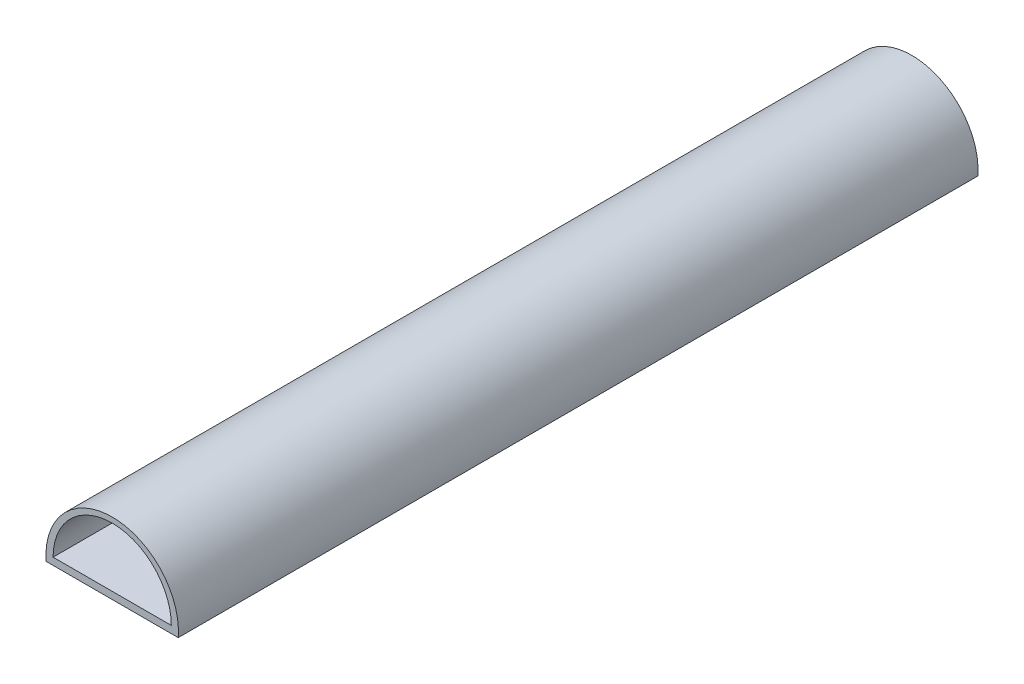
ISO-10303-21;
HEADER;
FILE_DESCRIPTION(('STEP AP214'),'2;1');
FILE_NAME('part.step','',(''),(''),'','','');
FILE_SCHEMA(('AUTOMOTIVE_DESIGN { 1 0 10303 214 1 1 1 1 }'));
ENDSEC;
DATA;
#1=APPLICATION_CONTEXT('core data for automotive mechanical design processes');
#2=APPLICATION_PROTOCOL_DEFINITION('international standard','automotive_design',2000,#1);
#3=PRODUCT_CONTEXT('',#1,'mechanical');
#4=PRODUCT('Part','Part','',(#3));
#5=PRODUCT_RELATED_PRODUCT_CATEGORY('part','',(#4));
#6=PRODUCT_DEFINITION_FORMATION('','',#4);
#7=PRODUCT_DEFINITION_CONTEXT('part definition',#1,'design');
#8=PRODUCT_DEFINITION('design','',#6,#7);
#9=PRODUCT_DEFINITION_SHAPE('','',#8);
#10=(LENGTH_UNIT() NAMED_UNIT(*) SI_UNIT(.MILLI.,.METRE.));
#11=(NAMED_UNIT(*) PLANE_ANGLE_UNIT() SI_UNIT($,.RADIAN.));
#12=(NAMED_UNIT(*) SI_UNIT($,.STERADIAN.) SOLID_ANGLE_UNIT());
#13=UNCERTAINTY_MEASURE_WITH_UNIT(LENGTH_MEASURE(1.E-05),#10,'distance_accuracy_value','');
#14=(GEOMETRIC_REPRESENTATION_CONTEXT(3) GLOBAL_UNCERTAINTY_ASSIGNED_CONTEXT((#13)) GLOBAL_UNIT_ASSIGNED_CONTEXT((#10,
#11,#12)) REPRESENTATION_CONTEXT('',''));
#15=CARTESIAN_POINT('',(0.,0.,0.));
#16=DIRECTION('',(0.,0.,1.));
#17=DIRECTION('',(1.,0.,0.));
#18=AXIS2_PLACEMENT_3D('',#15,#16,#17);
#19=CARTESIAN_POINT('',(-8.42700279293845,-8.87685553456328,177.8));
#20=DIRECTION('',(0.,0.,-1.));
#21=DIRECTION('',(-1.,0.,0.));
#22=AXIS2_PLACEMENT_3D('',#19,#20,#21);
#23=PLANE('',#22);
#24=CARTESIAN_POINT('',(-8.42700279293845,-8.87685553456328,177.8));
#25=DIRECTION('',(0.,0.,1.));
#26=DIRECTION('',(-1.,0.,0.));
#27=AXIS2_PLACEMENT_3D('',#24,#25,#26);
#28=CIRCLE('',#27,14.7310367744908);
#29=CARTESIAN_POINT('',(6.25737220706155,-10.0484251273645,177.8));
#30=VERTEX_POINT('',#29);
#31=CARTESIAN_POINT('',(-23.1113777929385,-10.0484251273645,177.8));
#32=VERTEX_POINT('',#31);
#33=EDGE_CURVE('E103',#30,#32,#28,.T.);
#34=ORIENTED_EDGE('',*,*,#33,.T.);
#35=DIRECTION('',(1.,0.,0.));
#36=VECTOR('',#35,1.);
#37=CARTESIAN_POINT('',(-23.1113777929385,-10.0484251273645,177.8));
#38=LINE('',#37,#36);
#39=EDGE_CURVE('E107',#32,#30,#38,.T.);
#40=ORIENTED_EDGE('',*,*,#39,.T.);
#41=EDGE_LOOP('',(#34,#40));
#42=FACE_BOUND('',#41,.T.);
#43=CARTESIAN_POINT('',(-8.42700279293845,-8.46092512736455,177.8));
#44=DIRECTION('',(0.,0.,1.));
#45=DIRECTION('',(-1.,0.,0.));
#46=AXIS2_PLACEMENT_3D('',#43,#44,#45);
#47=CIRCLE('',#46,13.1445);
#48=CARTESIAN_POINT('',(4.71749720706154,-8.46092512736455,177.8));
#49=VERTEX_POINT('',#48);
#50=CARTESIAN_POINT('',(-21.5715027929384,-8.46092512736455,177.8));
#51=VERTEX_POINT('',#50);
#52=EDGE_CURVE('E83',#49,#51,#47,.T.);
#53=ORIENTED_EDGE('',*,*,#52,.F.);
#54=DIRECTION('',(1.,0.,0.));
#55=VECTOR('',#54,1.);
#56=CARTESIAN_POINT('',(-8.42700279293845,-8.46092512736455,177.8));
#57=LINE('',#56,#55);
#58=EDGE_CURVE('E78',#51,#49,#57,.T.);
#59=ORIENTED_EDGE('',*,*,#58,.F.);
#60=EDGE_LOOP('',(#53,#59));
#61=FACE_BOUND('',#60,.T.);
#62=ADVANCED_FACE('F39',(#42,#61),#23,.F.);
#63=CARTESIAN_POINT('',(-8.42700279293845,-8.87685553456328,0.));
#64=DIRECTION('',(0.,0.,-1.));
#65=DIRECTION('',(-1.,0.,0.));
#66=AXIS2_PLACEMENT_3D('',#63,#64,#65);
#67=PLANE('',#66);
#68=CARTESIAN_POINT('',(-8.42700279293845,-8.87685553456328,0.));
#69=DIRECTION('',(0.,0.,1.));
#70=DIRECTION('',(-1.,0.,0.));
#71=AXIS2_PLACEMENT_3D('',#68,#69,#70);
#72=CIRCLE('',#71,14.7310367744908);
#73=CARTESIAN_POINT('',(6.25737220706155,-10.0484251273645,0.));
#74=VERTEX_POINT('',#73);
#75=CARTESIAN_POINT('',(-23.1113777929385,-10.0484251273645,0.));
#76=VERTEX_POINT('',#75);
#77=EDGE_CURVE('E92',#74,#76,#72,.T.);
#78=ORIENTED_EDGE('',*,*,#77,.F.);
#79=DIRECTION('',(1.,0.,0.));
#80=VECTOR('',#79,1.);
#81=CARTESIAN_POINT('',(-23.1113777929385,-10.0484251273645,0.));
#82=LINE('',#81,#80);
#83=EDGE_CURVE('E108',#76,#74,#82,.T.);
#84=ORIENTED_EDGE('',*,*,#83,.F.);
#85=EDGE_LOOP('',(#78,#84));
#86=FACE_BOUND('',#85,.T.);
#87=DIRECTION('',(1.,0.,0.));
#88=VECTOR('',#87,1.);
#89=CARTESIAN_POINT('',(-8.42700279293845,-8.46092512736455,0.));
#90=LINE('',#89,#88);
#91=CARTESIAN_POINT('',(-21.5715027929384,-8.46092512736455,0.));
#92=VERTEX_POINT('',#91);
#93=CARTESIAN_POINT('',(4.71749720706154,-8.46092512736455,0.));
#94=VERTEX_POINT('',#93);
#95=EDGE_CURVE('E84',#92,#94,#90,.T.);
#96=ORIENTED_EDGE('',*,*,#95,.T.);
#97=CARTESIAN_POINT('',(-8.42700279293845,-8.46092512736455,0.));
#98=DIRECTION('',(0.,0.,1.));
#99=DIRECTION('',(-1.,0.,0.));
#100=AXIS2_PLACEMENT_3D('',#97,#98,#99);
#101=CIRCLE('',#100,13.1445);
#102=EDGE_CURVE('E89',#94,#92,#101,.T.);
#103=ORIENTED_EDGE('',*,*,#102,.T.);
#104=EDGE_LOOP('',(#96,#103));
#105=FACE_BOUND('',#104,.T.);
#106=ADVANCED_FACE('F124',(#86,#105),#67,.T.);
#107=CARTESIAN_POINT('',(-8.42700279293845,-8.87685553456328,177.8));
#108=DIRECTION('',(0.,0.,-1.));
#109=DIRECTION('',(-1.,0.,0.));
#110=AXIS2_PLACEMENT_3D('',#107,#108,#109);
#111=CYLINDRICAL_SURFACE('',#110,14.7310367744908);
#112=ORIENTED_EDGE('',*,*,#77,.T.);
#113=DIRECTION('',(0.,0.,-1.));
#114=VECTOR('',#113,1.);
#115=CARTESIAN_POINT('',(-23.1113777929385,-10.0484251273645,177.8));
#116=LINE('',#115,#114);
#117=EDGE_CURVE('E11',#32,#76,#116,.T.);
#118=ORIENTED_EDGE('',*,*,#117,.F.);
#119=ORIENTED_EDGE('',*,*,#33,.F.);
#120=DIRECTION('',(0.,0.,-1.));
#121=VECTOR('',#120,1.);
#122=CARTESIAN_POINT('',(6.25737220706155,-10.0484251273645,177.8));
#123=LINE('',#122,#121);
#124=EDGE_CURVE('E48',#30,#74,#123,.T.);
#125=ORIENTED_EDGE('',*,*,#124,.T.);
#126=EDGE_LOOP('',(#112,#118,#119,#125));
#127=FACE_BOUND('',#126,.T.);
#128=ADVANCED_FACE('F41',(#127),#111,.T.);
#129=CARTESIAN_POINT('',(-23.1113777929385,-10.0484251273645,177.8));
#130=DIRECTION('',(0.,1.,0.));
#131=DIRECTION('',(0.,0.,1.));
#132=AXIS2_PLACEMENT_3D('',#129,#130,#131);
#133=PLANE('',#132);
#134=ORIENTED_EDGE('',*,*,#83,.T.);
#135=ORIENTED_EDGE('',*,*,#124,.F.);
#136=ORIENTED_EDGE('',*,*,#39,.F.);
#137=ORIENTED_EDGE('',*,*,#117,.T.);
#138=EDGE_LOOP('',(#134,#135,#136,#137));
#139=FACE_BOUND('',#138,.T.);
#140=ADVANCED_FACE('F126',(#139),#133,.F.);
#141=CARTESIAN_POINT('',(-8.42700279293845,-8.46092512736455,177.8));
#142=DIRECTION('',(0.,0.,-1.));
#143=DIRECTION('',(-1.,0.,0.));
#144=AXIS2_PLACEMENT_3D('',#141,#142,#143);
#145=CYLINDRICAL_SURFACE('',#144,13.1445);
#146=ORIENTED_EDGE('',*,*,#102,.F.);
#147=DIRECTION('',(0.,0.,-1.));
#148=VECTOR('',#147,1.);
#149=CARTESIAN_POINT('',(4.71749720706154,-8.46092512736455,177.8));
#150=LINE('',#149,#148);
#151=EDGE_CURVE('E60',#49,#94,#150,.T.);
#152=ORIENTED_EDGE('',*,*,#151,.F.);
#153=ORIENTED_EDGE('',*,*,#52,.T.);
#154=DIRECTION('',(0.,0.,-1.));
#155=VECTOR('',#154,1.);
#156=CARTESIAN_POINT('',(-21.5715027929384,-8.46092512736455,177.8));
#157=LINE('',#156,#155);
#158=EDGE_CURVE('E55',#51,#92,#157,.T.);
#159=ORIENTED_EDGE('',*,*,#158,.T.);
#160=EDGE_LOOP('',(#146,#152,#153,#159));
#161=FACE_BOUND('',#160,.T.);
#162=ADVANCED_FACE('F87',(#161),#145,.F.);
#163=CARTESIAN_POINT('',(-8.42700279293845,-8.46092512736455,177.8));
#164=DIRECTION('',(0.,1.,0.));
#165=DIRECTION('',(-1.,0.,0.));
#166=AXIS2_PLACEMENT_3D('',#163,#164,#165);
#167=PLANE('',#166);
#168=ORIENTED_EDGE('',*,*,#95,.F.);
#169=ORIENTED_EDGE('',*,*,#158,.F.);
#170=ORIENTED_EDGE('',*,*,#58,.T.);
#171=ORIENTED_EDGE('',*,*,#151,.T.);
#172=EDGE_LOOP('',(#168,#169,#170,#171));
#173=FACE_BOUND('',#172,.T.);
#174=ADVANCED_FACE('F79',(#173),#167,.T.);
#175=CLOSED_SHELL('',(#62,#106,#128,#140,#162,#174));
#176=MANIFOLD_SOLID_BREP('B2',#175);
#177=ADVANCED_BREP_SHAPE_REPRESENTATION('',(#18,#176),#14);
#178=SHAPE_DEFINITION_REPRESENTATION(#9,#177);
ENDSEC;
END-ISO-10303-21;
